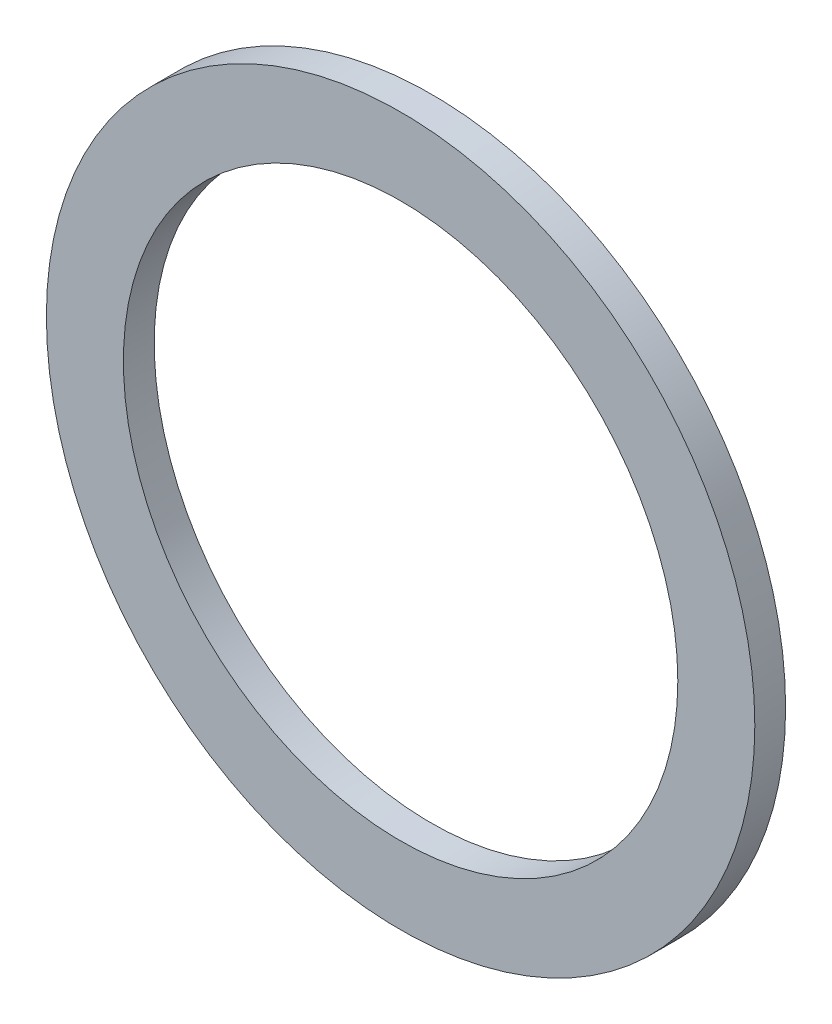
ISO-10303-21;
HEADER;
FILE_DESCRIPTION(('STEP AP214'),'2;1');
FILE_NAME('part.step','',(''),(''),'','','');
FILE_SCHEMA(('AUTOMOTIVE_DESIGN { 1 0 10303 214 1 1 1 1 }'));
ENDSEC;
DATA;
#1=APPLICATION_CONTEXT('core data for automotive mechanical design processes');
#2=APPLICATION_PROTOCOL_DEFINITION('international standard','automotive_design',2000,#1);
#3=PRODUCT_CONTEXT('',#1,'mechanical');
#4=PRODUCT('Part','Part','',(#3));
#5=PRODUCT_RELATED_PRODUCT_CATEGORY('part','',(#4));
#6=PRODUCT_DEFINITION_FORMATION('','',#4);
#7=PRODUCT_DEFINITION_CONTEXT('part definition',#1,'design');
#8=PRODUCT_DEFINITION('design','',#6,#7);
#9=PRODUCT_DEFINITION_SHAPE('','',#8);
#10=(LENGTH_UNIT() NAMED_UNIT(*) SI_UNIT(.MILLI.,.METRE.));
#11=(NAMED_UNIT(*) PLANE_ANGLE_UNIT() SI_UNIT($,.RADIAN.));
#12=(NAMED_UNIT(*) SI_UNIT($,.STERADIAN.) SOLID_ANGLE_UNIT());
#13=UNCERTAINTY_MEASURE_WITH_UNIT(LENGTH_MEASURE(1.E-05),#10,'distance_accuracy_value','');
#14=(GEOMETRIC_REPRESENTATION_CONTEXT(3) GLOBAL_UNCERTAINTY_ASSIGNED_CONTEXT((#13)) GLOBAL_UNIT_ASSIGNED_CONTEXT((#10,
#11,#12)) REPRESENTATION_CONTEXT('',''));
#15=CARTESIAN_POINT('',(0.,0.,0.));
#16=DIRECTION('',(0.,0.,1.));
#17=DIRECTION('',(1.,0.,0.));
#18=AXIS2_PLACEMENT_3D('',#15,#16,#17);
#19=CARTESIAN_POINT('',(0.,0.,5.));
#20=DIRECTION('',(0.,0.,1.));
#21=DIRECTION('',(1.,0.,0.));
#22=AXIS2_PLACEMENT_3D('',#19,#20,#21);
#23=PLANE('',#22);
#24=CARTESIAN_POINT('',(0.,0.,5.));
#25=DIRECTION('',(0.,0.,1.));
#26=DIRECTION('',(1.,0.,0.));
#27=AXIS2_PLACEMENT_3D('',#24,#25,#26);
#28=CIRCLE('',#27,115.);
#29=CARTESIAN_POINT('',(115.,0.,5.));
#30=VERTEX_POINT('',#29);
#31=EDGE_CURVE('E10',#30,#30,#28,.T.);
#32=ORIENTED_EDGE('',*,*,#31,.T.);
#33=EDGE_LOOP('',(#32));
#34=FACE_BOUND('',#33,.T.);
#35=CARTESIAN_POINT('',(0.,0.,5.));
#36=DIRECTION('',(0.,0.,1.));
#37=DIRECTION('',(1.,0.,0.));
#38=AXIS2_PLACEMENT_3D('',#35,#36,#37);
#39=CIRCLE('',#38,90.);
#40=CARTESIAN_POINT('',(90.,0.,5.));
#41=VERTEX_POINT('',#40);
#42=EDGE_CURVE('E48',#41,#41,#39,.T.);
#43=ORIENTED_EDGE('',*,*,#42,.F.);
#44=EDGE_LOOP('',(#43));
#45=FACE_BOUND('',#44,.T.);
#46=ADVANCED_FACE('F37',(#34,#45),#23,.T.);
#47=CARTESIAN_POINT('',(0.,0.,-5.));
#48=DIRECTION('',(0.,0.,1.));
#49=DIRECTION('',(1.,0.,0.));
#50=AXIS2_PLACEMENT_3D('',#47,#48,#49);
#51=PLANE('',#50);
#52=CARTESIAN_POINT('',(0.,0.,-5.));
#53=DIRECTION('',(0.,0.,1.));
#54=DIRECTION('',(1.,0.,0.));
#55=AXIS2_PLACEMENT_3D('',#52,#53,#54);
#56=CIRCLE('',#55,115.);
#57=CARTESIAN_POINT('',(115.,0.,-5.));
#58=VERTEX_POINT('',#57);
#59=EDGE_CURVE('E41',#58,#58,#56,.T.);
#60=ORIENTED_EDGE('',*,*,#59,.F.);
#61=EDGE_LOOP('',(#60));
#62=FACE_BOUND('',#61,.T.);
#63=CARTESIAN_POINT('',(0.,0.,-5.));
#64=DIRECTION('',(0.,0.,1.));
#65=DIRECTION('',(1.,0.,0.));
#66=AXIS2_PLACEMENT_3D('',#63,#64,#65);
#67=CIRCLE('',#66,90.);
#68=CARTESIAN_POINT('',(90.,0.,-5.));
#69=VERTEX_POINT('',#68);
#70=EDGE_CURVE('E50',#69,#69,#67,.T.);
#71=ORIENTED_EDGE('',*,*,#70,.T.);
#72=EDGE_LOOP('',(#71));
#73=FACE_BOUND('',#72,.T.);
#74=ADVANCED_FACE('F60',(#62,#73),#51,.F.);
#75=CARTESIAN_POINT('',(0.,0.,5.));
#76=DIRECTION('',(0.,0.,-1.));
#77=DIRECTION('',(-1.,0.,0.));
#78=AXIS2_PLACEMENT_3D('',#75,#76,#77);
#79=CYLINDRICAL_SURFACE('',#78,115.);
#80=ORIENTED_EDGE('',*,*,#31,.F.);
#81=EDGE_LOOP('',(#80));
#82=FACE_BOUND('',#81,.T.);
#83=ORIENTED_EDGE('',*,*,#59,.T.);
#84=EDGE_LOOP('',(#83));
#85=FACE_BOUND('',#84,.T.);
#86=ADVANCED_FACE('F39',(#82,#85),#79,.T.);
#87=CARTESIAN_POINT('',(0.,0.,5.));
#88=DIRECTION('',(0.,0.,-1.));
#89=DIRECTION('',(-1.,0.,0.));
#90=AXIS2_PLACEMENT_3D('',#87,#88,#89);
#91=CYLINDRICAL_SURFACE('',#90,90.);
#92=ORIENTED_EDGE('',*,*,#42,.T.);
#93=EDGE_LOOP('',(#92));
#94=FACE_BOUND('',#93,.T.);
#95=ORIENTED_EDGE('',*,*,#70,.F.);
#96=EDGE_LOOP('',(#95));
#97=FACE_BOUND('',#96,.T.);
#98=ADVANCED_FACE('F56',(#94,#97),#91,.F.);
#99=CLOSED_SHELL('',(#46,#74,#86,#98));
#100=MANIFOLD_SOLID_BREP('B2',#99);
#101=ADVANCED_BREP_SHAPE_REPRESENTATION('',(#18,#100),#14);
#102=SHAPE_DEFINITION_REPRESENTATION(#9,#101);
ENDSEC;
END-ISO-10303-21;
